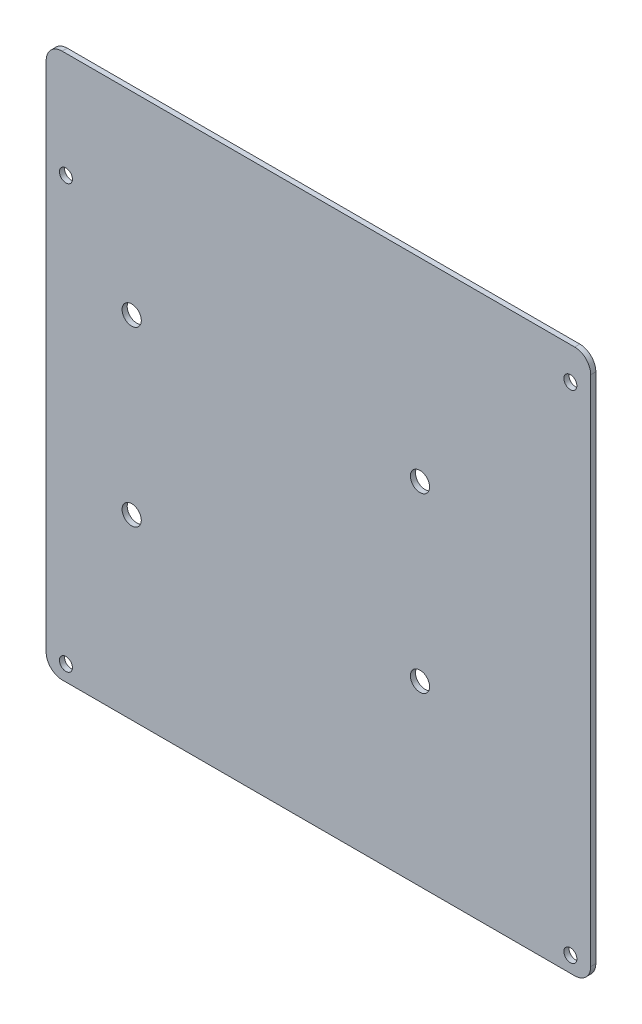
ISO-10303-21;
HEADER;
FILE_DESCRIPTION(('STEP AP214'),'2;1');
FILE_NAME('part.step','',(''),(''),'','','');
FILE_SCHEMA(('AUTOMOTIVE_DESIGN { 1 0 10303 214 1 1 1 1 }'));
ENDSEC;
DATA;
#1=APPLICATION_CONTEXT('core data for automotive mechanical design processes');
#2=APPLICATION_PROTOCOL_DEFINITION('international standard','automotive_design',2000,#1);
#3=PRODUCT_CONTEXT('',#1,'mechanical');
#4=PRODUCT('Part','Part','',(#3));
#5=PRODUCT_RELATED_PRODUCT_CATEGORY('part','',(#4));
#6=PRODUCT_DEFINITION_FORMATION('','',#4);
#7=PRODUCT_DEFINITION_CONTEXT('part definition',#1,'design');
#8=PRODUCT_DEFINITION('design','',#6,#7);
#9=PRODUCT_DEFINITION_SHAPE('','',#8);
#10=(LENGTH_UNIT() NAMED_UNIT(*) SI_UNIT(.MILLI.,.METRE.));
#11=(NAMED_UNIT(*) PLANE_ANGLE_UNIT() SI_UNIT($,.RADIAN.));
#12=(NAMED_UNIT(*) SI_UNIT($,.STERADIAN.) SOLID_ANGLE_UNIT());
#13=UNCERTAINTY_MEASURE_WITH_UNIT(LENGTH_MEASURE(1.E-05),#10,'distance_accuracy_value','');
#14=(GEOMETRIC_REPRESENTATION_CONTEXT(3) GLOBAL_UNCERTAINTY_ASSIGNED_CONTEXT((#13)) GLOBAL_UNIT_ASSIGNED_CONTEXT((#10,
#11,#12)) REPRESENTATION_CONTEXT('',''));
#15=CARTESIAN_POINT('',(0.,0.,0.));
#16=DIRECTION('',(0.,0.,1.));
#17=DIRECTION('',(1.,0.,0.));
#18=AXIS2_PLACEMENT_3D('',#15,#16,#17);
#19=CARTESIAN_POINT('',(-85.,-85.,1.6));
#20=DIRECTION('',(1.,0.,0.));
#21=DIRECTION('',(0.,0.,-1.));
#22=AXIS2_PLACEMENT_3D('',#19,#20,#21);
#23=PLANE('',#22);
#24=DIRECTION('',(0.,-1.,0.));
#25=VECTOR('',#24,1.);
#26=CARTESIAN_POINT('',(-85.,-85.,1.6));
#27=LINE('',#26,#25);
#28=CARTESIAN_POINT('',(-85.,80.,1.6));
#29=VERTEX_POINT('',#28);
#30=CARTESIAN_POINT('',(-85.,-80.,1.6));
#31=VERTEX_POINT('',#30);
#32=EDGE_CURVE('E119',#29,#31,#27,.T.);
#33=ORIENTED_EDGE('',*,*,#32,.F.);
#34=DIRECTION('',(0.,0.,-1.));
#35=VECTOR('',#34,1.);
#36=CARTESIAN_POINT('',(-85.,80.,1.6));
#37=LINE('',#36,#35);
#38=CARTESIAN_POINT('',(-85.,80.,0.));
#39=VERTEX_POINT('',#38);
#40=EDGE_CURVE('E104',#29,#39,#37,.T.);
#41=ORIENTED_EDGE('',*,*,#40,.T.);
#42=DIRECTION('',(0.,-1.,0.));
#43=VECTOR('',#42,1.);
#44=CARTESIAN_POINT('',(-85.,-85.,0.));
#45=LINE('',#44,#43);
#46=CARTESIAN_POINT('',(-85.,-80.,0.));
#47=VERTEX_POINT('',#46);
#48=EDGE_CURVE('E116',#39,#47,#45,.T.);
#49=ORIENTED_EDGE('',*,*,#48,.T.);
#50=DIRECTION('',(0.,0.,-1.));
#51=VECTOR('',#50,1.);
#52=CARTESIAN_POINT('',(-85.,-80.,1.6));
#53=LINE('',#52,#51);
#54=EDGE_CURVE('E121',#47,#31,#53,.F.);
#55=ORIENTED_EDGE('',*,*,#54,.T.);
#56=EDGE_LOOP('',(#33,#41,#49,#55));
#57=FACE_BOUND('',#56,.T.);
#58=ADVANCED_FACE('F34',(#57),#23,.F.);
#59=CARTESIAN_POINT('',(85.,-85.,1.6));
#60=DIRECTION('',(0.,1.,0.));
#61=DIRECTION('',(-1.,0.,0.));
#62=AXIS2_PLACEMENT_3D('',#59,#60,#61);
#63=PLANE('',#62);
#64=DIRECTION('',(1.,0.,0.));
#65=VECTOR('',#64,1.);
#66=CARTESIAN_POINT('',(85.,-85.,0.));
#67=LINE('',#66,#65);
#68=CARTESIAN_POINT('',(-80.,-85.,0.));
#69=VERTEX_POINT('',#68);
#70=CARTESIAN_POINT('',(80.,-85.,0.));
#71=VERTEX_POINT('',#70);
#72=EDGE_CURVE('E125',#69,#71,#67,.T.);
#73=ORIENTED_EDGE('',*,*,#72,.T.);
#74=DIRECTION('',(0.,0.,-1.));
#75=VECTOR('',#74,1.);
#76=CARTESIAN_POINT('',(80.,-85.,1.6));
#77=LINE('',#76,#75);
#78=CARTESIAN_POINT('',(80.,-85.,1.6));
#79=VERTEX_POINT('',#78);
#80=EDGE_CURVE('E11',#71,#79,#77,.F.);
#81=ORIENTED_EDGE('',*,*,#80,.T.);
#82=DIRECTION('',(1.,0.,0.));
#83=VECTOR('',#82,1.);
#84=CARTESIAN_POINT('',(85.,-85.,1.6));
#85=LINE('',#84,#83);
#86=CARTESIAN_POINT('',(-80.,-85.,1.6));
#87=VERTEX_POINT('',#86);
#88=EDGE_CURVE('E165',#87,#79,#85,.T.);
#89=ORIENTED_EDGE('',*,*,#88,.F.);
#90=DIRECTION('',(0.,0.,-1.));
#91=VECTOR('',#90,1.);
#92=CARTESIAN_POINT('',(-80.,-85.,1.6));
#93=LINE('',#92,#91);
#94=EDGE_CURVE('E42',#87,#69,#93,.T.);
#95=ORIENTED_EDGE('',*,*,#94,.T.);
#96=EDGE_LOOP('',(#73,#81,#89,#95));
#97=FACE_BOUND('',#96,.T.);
#98=ADVANCED_FACE('F163',(#97),#63,.F.);
#99=CARTESIAN_POINT('',(85.,-85.,1.6));
#100=DIRECTION('',(-1.,0.,0.));
#101=DIRECTION('',(0.,0.,1.));
#102=AXIS2_PLACEMENT_3D('',#99,#100,#101);
#103=PLANE('',#102);
#104=DIRECTION('',(0.,1.,0.));
#105=VECTOR('',#104,1.);
#106=CARTESIAN_POINT('',(85.,-85.,0.));
#107=LINE('',#106,#105);
#108=CARTESIAN_POINT('',(85.,-80.,0.));
#109=VERTEX_POINT('',#108);
#110=CARTESIAN_POINT('',(85.,80.,0.));
#111=VERTEX_POINT('',#110);
#112=EDGE_CURVE('E129',#109,#111,#107,.T.);
#113=ORIENTED_EDGE('',*,*,#112,.T.);
#114=DIRECTION('',(0.,0.,-1.));
#115=VECTOR('',#114,1.);
#116=CARTESIAN_POINT('',(85.,80.,1.6));
#117=LINE('',#116,#115);
#118=CARTESIAN_POINT('',(85.,80.,1.6));
#119=VERTEX_POINT('',#118);
#120=EDGE_CURVE('E49',#111,#119,#117,.F.);
#121=ORIENTED_EDGE('',*,*,#120,.T.);
#122=DIRECTION('',(0.,1.,0.));
#123=VECTOR('',#122,1.);
#124=CARTESIAN_POINT('',(85.,-85.,1.6));
#125=LINE('',#124,#123);
#126=CARTESIAN_POINT('',(85.,-80.,1.6));
#127=VERTEX_POINT('',#126);
#128=EDGE_CURVE('E173',#127,#119,#125,.T.);
#129=ORIENTED_EDGE('',*,*,#128,.F.);
#130=DIRECTION('',(0.,0.,-1.));
#131=VECTOR('',#130,1.);
#132=CARTESIAN_POINT('',(85.,-80.,1.6));
#133=LINE('',#132,#131);
#134=EDGE_CURVE('E156',#127,#109,#133,.T.);
#135=ORIENTED_EDGE('',*,*,#134,.T.);
#136=EDGE_LOOP('',(#113,#121,#129,#135));
#137=FACE_BOUND('',#136,.T.);
#138=ADVANCED_FACE('F172',(#137),#103,.F.);
#139=CARTESIAN_POINT('',(85.,85.,1.6));
#140=DIRECTION('',(0.,-1.,0.));
#141=DIRECTION('',(1.,0.,0.));
#142=AXIS2_PLACEMENT_3D('',#139,#140,#141);
#143=PLANE('',#142);
#144=DIRECTION('',(-1.,0.,0.));
#145=VECTOR('',#144,1.);
#146=CARTESIAN_POINT('',(85.,85.,0.));
#147=LINE('',#146,#145);
#148=CARTESIAN_POINT('',(80.,85.,0.));
#149=VERTEX_POINT('',#148);
#150=CARTESIAN_POINT('',(-80.,85.,0.));
#151=VERTEX_POINT('',#150);
#152=EDGE_CURVE('E139',#149,#151,#147,.T.);
#153=ORIENTED_EDGE('',*,*,#152,.T.);
#154=DIRECTION('',(0.,0.,-1.));
#155=VECTOR('',#154,1.);
#156=CARTESIAN_POINT('',(-80.,85.,1.6));
#157=LINE('',#156,#155);
#158=CARTESIAN_POINT('',(-80.,85.,1.6));
#159=VERTEX_POINT('',#158);
#160=EDGE_CURVE('E105',#151,#159,#157,.F.);
#161=ORIENTED_EDGE('',*,*,#160,.T.);
#162=DIRECTION('',(-1.,0.,0.));
#163=VECTOR('',#162,1.);
#164=CARTESIAN_POINT('',(85.,85.,1.6));
#165=LINE('',#164,#163);
#166=CARTESIAN_POINT('',(80.,85.,1.6));
#167=VERTEX_POINT('',#166);
#168=EDGE_CURVE('E135',#167,#159,#165,.T.);
#169=ORIENTED_EDGE('',*,*,#168,.F.);
#170=DIRECTION('',(0.,0.,-1.));
#171=VECTOR('',#170,1.);
#172=CARTESIAN_POINT('',(80.,85.,1.6));
#173=LINE('',#172,#171);
#174=EDGE_CURVE('E110',#167,#149,#173,.T.);
#175=ORIENTED_EDGE('',*,*,#174,.T.);
#176=EDGE_LOOP('',(#153,#161,#169,#175));
#177=FACE_BOUND('',#176,.T.);
#178=ADVANCED_FACE('F237',(#177),#143,.F.);
#179=CARTESIAN_POINT('',(0.,0.,1.6));
#180=DIRECTION('',(0.,0.,1.));
#181=DIRECTION('',(1.,0.,0.));
#182=AXIS2_PLACEMENT_3D('',#179,#180,#181);
#183=PLANE('',#182);
#184=CARTESIAN_POINT('',(-58.3,-29.5,1.6));
#185=DIRECTION('',(0.,0.,1.));
#186=DIRECTION('',(1.,0.,0.));
#187=AXIS2_PLACEMENT_3D('',#184,#185,#186);
#188=CIRCLE('',#187,3.);
#189=CARTESIAN_POINT('',(-55.3,-29.5,1.6));
#190=VERTEX_POINT('',#189);
#191=EDGE_CURVE('E206',#190,#190,#188,.T.);
#192=ORIENTED_EDGE('',*,*,#191,.F.);
#193=EDGE_LOOP('',(#192));
#194=FACE_BOUND('',#193,.T.);
#195=CARTESIAN_POINT('',(31.7,-29.5,1.6));
#196=DIRECTION('',(0.,0.,1.));
#197=DIRECTION('',(1.,0.,0.));
#198=AXIS2_PLACEMENT_3D('',#195,#196,#197);
#199=CIRCLE('',#198,3.);
#200=CARTESIAN_POINT('',(34.7,-29.5,1.6));
#201=VERTEX_POINT('',#200);
#202=EDGE_CURVE('E212',#201,#201,#199,.T.);
#203=ORIENTED_EDGE('',*,*,#202,.F.);
#204=EDGE_LOOP('',(#203));
#205=FACE_BOUND('',#204,.T.);
#206=CARTESIAN_POINT('',(31.7,24.5,1.6));
#207=DIRECTION('',(0.,0.,1.));
#208=DIRECTION('',(1.,0.,0.));
#209=AXIS2_PLACEMENT_3D('',#206,#207,#208);
#210=CIRCLE('',#209,3.);
#211=CARTESIAN_POINT('',(34.7,24.5,1.6));
#212=VERTEX_POINT('',#211);
#213=EDGE_CURVE('E218',#212,#212,#210,.T.);
#214=ORIENTED_EDGE('',*,*,#213,.F.);
#215=EDGE_LOOP('',(#214));
#216=FACE_BOUND('',#215,.T.);
#217=CARTESIAN_POINT('',(-58.3,24.5,1.6));
#218=DIRECTION('',(0.,0.,1.));
#219=DIRECTION('',(1.,0.,0.));
#220=AXIS2_PLACEMENT_3D('',#217,#218,#219);
#221=CIRCLE('',#220,3.);
#222=CARTESIAN_POINT('',(-55.3,24.5,1.6));
#223=VERTEX_POINT('',#222);
#224=EDGE_CURVE('E200',#223,#223,#221,.T.);
#225=ORIENTED_EDGE('',*,*,#224,.F.);
#226=EDGE_LOOP('',(#225));
#227=FACE_BOUND('',#226,.T.);
#228=CARTESIAN_POINT('',(78.65,74.84,1.6));
#229=DIRECTION('',(0.,0.,1.));
#230=DIRECTION('',(1.,0.,0.));
#231=AXIS2_PLACEMENT_3D('',#228,#229,#230);
#232=CIRCLE('',#231,2.03);
#233=CARTESIAN_POINT('',(80.68,74.84,1.6));
#234=VERTEX_POINT('',#233);
#235=EDGE_CURVE('E189',#234,#234,#232,.T.);
#236=ORIENTED_EDGE('',*,*,#235,.F.);
#237=EDGE_LOOP('',(#236));
#238=FACE_BOUND('',#237,.T.);
#239=CARTESIAN_POINT('',(-78.83,-80.1,1.6));
#240=DIRECTION('',(0.,0.,1.));
#241=DIRECTION('',(1.,0.,0.));
#242=AXIS2_PLACEMENT_3D('',#239,#240,#241);
#243=CIRCLE('',#242,2.03);
#244=CARTESIAN_POINT('',(-76.8,-80.1,1.6));
#245=VERTEX_POINT('',#244);
#246=EDGE_CURVE('E182',#245,#245,#243,.T.);
#247=ORIENTED_EDGE('',*,*,#246,.F.);
#248=EDGE_LOOP('',(#247));
#249=FACE_BOUND('',#248,.T.);
#250=CARTESIAN_POINT('',(78.65,-80.1,1.6));
#251=DIRECTION('',(0.,0.,1.));
#252=DIRECTION('',(1.,0.,0.));
#253=AXIS2_PLACEMENT_3D('',#250,#251,#252);
#254=CIRCLE('',#253,2.03);
#255=CARTESIAN_POINT('',(80.68,-80.1,1.6));
#256=VERTEX_POINT('',#255);
#257=EDGE_CURVE('E194',#256,#256,#254,.T.);
#258=ORIENTED_EDGE('',*,*,#257,.F.);
#259=EDGE_LOOP('',(#258));
#260=FACE_BOUND('',#259,.T.);
#261=CARTESIAN_POINT('',(-78.83,51.98,1.6));
#262=DIRECTION('',(0.,0.,1.));
#263=DIRECTION('',(1.,0.,0.));
#264=AXIS2_PLACEMENT_3D('',#261,#262,#263);
#265=CIRCLE('',#264,2.03);
#266=CARTESIAN_POINT('',(-76.8,51.98,1.6));
#267=VERTEX_POINT('',#266);
#268=EDGE_CURVE('E132',#267,#267,#265,.T.);
#269=ORIENTED_EDGE('',*,*,#268,.F.);
#270=EDGE_LOOP('',(#269));
#271=FACE_BOUND('',#270,.T.);
#272=ORIENTED_EDGE('',*,*,#168,.T.);
#273=CARTESIAN_POINT('',(-80.,80.,1.6));
#274=DIRECTION('',(0.,0.,1.));
#275=DIRECTION('',(1.,0.,0.));
#276=AXIS2_PLACEMENT_3D('',#273,#274,#275);
#277=CIRCLE('',#276,5.);
#278=EDGE_CURVE('E154',#159,#29,#277,.T.);
#279=ORIENTED_EDGE('',*,*,#278,.T.);
#280=ORIENTED_EDGE('',*,*,#32,.T.);
#281=CARTESIAN_POINT('',(-80.,-80.,1.6));
#282=DIRECTION('',(0.,0.,1.));
#283=DIRECTION('',(1.,0.,0.));
#284=AXIS2_PLACEMENT_3D('',#281,#282,#283);
#285=CIRCLE('',#284,5.);
#286=EDGE_CURVE('E149',#31,#87,#285,.T.);
#287=ORIENTED_EDGE('',*,*,#286,.T.);
#288=ORIENTED_EDGE('',*,*,#88,.T.);
#289=CARTESIAN_POINT('',(80.,-80.,1.6));
#290=DIRECTION('',(0.,0.,1.));
#291=DIRECTION('',(1.,0.,0.));
#292=AXIS2_PLACEMENT_3D('',#289,#290,#291);
#293=CIRCLE('',#292,5.);
#294=EDGE_CURVE('E56',#79,#127,#293,.T.);
#295=ORIENTED_EDGE('',*,*,#294,.T.);
#296=ORIENTED_EDGE('',*,*,#128,.T.);
#297=CARTESIAN_POINT('',(80.,80.,1.6));
#298=DIRECTION('',(0.,0.,1.));
#299=DIRECTION('',(1.,0.,0.));
#300=AXIS2_PLACEMENT_3D('',#297,#298,#299);
#301=CIRCLE('',#300,5.);
#302=EDGE_CURVE('E152',#119,#167,#301,.T.);
#303=ORIENTED_EDGE('',*,*,#302,.T.);
#304=EDGE_LOOP('',(#272,#279,#280,#287,#288,#295,#296,#303));
#305=FACE_BOUND('',#304,.T.);
#306=ADVANCED_FACE('F234',(#194,#205,#216,#227,#238,#249,#260,#271,#305),#183,.T.);
#307=CARTESIAN_POINT('',(0.,0.,0.));
#308=DIRECTION('',(0.,0.,1.));
#309=DIRECTION('',(1.,0.,0.));
#310=AXIS2_PLACEMENT_3D('',#307,#308,#309);
#311=PLANE('',#310);
#312=CARTESIAN_POINT('',(-58.3,-29.5,0.));
#313=DIRECTION('',(0.,0.,1.));
#314=DIRECTION('',(1.,0.,0.));
#315=AXIS2_PLACEMENT_3D('',#312,#313,#314);
#316=CIRCLE('',#315,3.);
#317=CARTESIAN_POINT('',(-55.3,-29.5,0.));
#318=VERTEX_POINT('',#317);
#319=EDGE_CURVE('E209',#318,#318,#316,.T.);
#320=ORIENTED_EDGE('',*,*,#319,.T.);
#321=EDGE_LOOP('',(#320));
#322=FACE_BOUND('',#321,.T.);
#323=CARTESIAN_POINT('',(31.7,-29.5,0.));
#324=DIRECTION('',(0.,0.,1.));
#325=DIRECTION('',(1.,0.,0.));
#326=AXIS2_PLACEMENT_3D('',#323,#324,#325);
#327=CIRCLE('',#326,3.);
#328=CARTESIAN_POINT('',(34.7,-29.5,0.));
#329=VERTEX_POINT('',#328);
#330=EDGE_CURVE('E215',#329,#329,#327,.T.);
#331=ORIENTED_EDGE('',*,*,#330,.T.);
#332=EDGE_LOOP('',(#331));
#333=FACE_BOUND('',#332,.T.);
#334=CARTESIAN_POINT('',(31.7,24.5,0.));
#335=DIRECTION('',(0.,0.,1.));
#336=DIRECTION('',(1.,0.,0.));
#337=AXIS2_PLACEMENT_3D('',#334,#335,#336);
#338=CIRCLE('',#337,3.);
#339=CARTESIAN_POINT('',(34.7,24.5,0.));
#340=VERTEX_POINT('',#339);
#341=EDGE_CURVE('E203',#340,#340,#338,.T.);
#342=ORIENTED_EDGE('',*,*,#341,.T.);
#343=EDGE_LOOP('',(#342));
#344=FACE_BOUND('',#343,.T.);
#345=CARTESIAN_POINT('',(-58.3,24.5,0.));
#346=DIRECTION('',(0.,0.,1.));
#347=DIRECTION('',(1.,0.,0.));
#348=AXIS2_PLACEMENT_3D('',#345,#346,#347);
#349=CIRCLE('',#348,3.);
#350=CARTESIAN_POINT('',(-55.3,24.5,0.));
#351=VERTEX_POINT('',#350);
#352=EDGE_CURVE('E197',#351,#351,#349,.T.);
#353=ORIENTED_EDGE('',*,*,#352,.T.);
#354=EDGE_LOOP('',(#353));
#355=FACE_BOUND('',#354,.T.);
#356=CARTESIAN_POINT('',(78.65,74.84,0.));
#357=DIRECTION('',(0.,0.,1.));
#358=DIRECTION('',(1.,0.,0.));
#359=AXIS2_PLACEMENT_3D('',#356,#357,#358);
#360=CIRCLE('',#359,2.03);
#361=CARTESIAN_POINT('',(80.68,74.84,0.));
#362=VERTEX_POINT('',#361);
#363=EDGE_CURVE('E180',#362,#362,#360,.T.);
#364=ORIENTED_EDGE('',*,*,#363,.T.);
#365=EDGE_LOOP('',(#364));
#366=FACE_BOUND('',#365,.T.);
#367=CARTESIAN_POINT('',(-78.83,-80.1,0.));
#368=DIRECTION('',(0.,0.,1.));
#369=DIRECTION('',(1.,0.,0.));
#370=AXIS2_PLACEMENT_3D('',#367,#368,#369);
#371=CIRCLE('',#370,2.03);
#372=CARTESIAN_POINT('',(-76.8,-80.1,0.));
#373=VERTEX_POINT('',#372);
#374=EDGE_CURVE('E185',#373,#373,#371,.T.);
#375=ORIENTED_EDGE('',*,*,#374,.T.);
#376=EDGE_LOOP('',(#375));
#377=FACE_BOUND('',#376,.T.);
#378=CARTESIAN_POINT('',(78.65,-80.1,0.));
#379=DIRECTION('',(0.,0.,1.));
#380=DIRECTION('',(1.,0.,0.));
#381=AXIS2_PLACEMENT_3D('',#378,#379,#380);
#382=CIRCLE('',#381,2.03);
#383=CARTESIAN_POINT('',(80.68,-80.1,0.));
#384=VERTEX_POINT('',#383);
#385=EDGE_CURVE('E186',#384,#384,#382,.T.);
#386=ORIENTED_EDGE('',*,*,#385,.T.);
#387=EDGE_LOOP('',(#386));
#388=FACE_BOUND('',#387,.T.);
#389=CARTESIAN_POINT('',(-78.83,51.98,0.));
#390=DIRECTION('',(0.,0.,1.));
#391=DIRECTION('',(1.,0.,0.));
#392=AXIS2_PLACEMENT_3D('',#389,#390,#391);
#393=CIRCLE('',#392,2.03);
#394=CARTESIAN_POINT('',(-76.8,51.98,0.));
#395=VERTEX_POINT('',#394);
#396=EDGE_CURVE('E126',#395,#395,#393,.T.);
#397=ORIENTED_EDGE('',*,*,#396,.T.);
#398=EDGE_LOOP('',(#397));
#399=FACE_BOUND('',#398,.T.);
#400=ORIENTED_EDGE('',*,*,#48,.F.);
#401=CARTESIAN_POINT('',(-80.,80.,0.));
#402=DIRECTION('',(0.,0.,1.));
#403=DIRECTION('',(1.,0.,0.));
#404=AXIS2_PLACEMENT_3D('',#401,#402,#403);
#405=CIRCLE('',#404,5.);
#406=EDGE_CURVE('E100',#39,#151,#405,.F.);
#407=ORIENTED_EDGE('',*,*,#406,.T.);
#408=ORIENTED_EDGE('',*,*,#152,.F.);
#409=CARTESIAN_POINT('',(80.,80.,0.));
#410=DIRECTION('',(0.,0.,1.));
#411=DIRECTION('',(1.,0.,0.));
#412=AXIS2_PLACEMENT_3D('',#409,#410,#411);
#413=CIRCLE('',#412,5.);
#414=EDGE_CURVE('E111',#149,#111,#413,.F.);
#415=ORIENTED_EDGE('',*,*,#414,.T.);
#416=ORIENTED_EDGE('',*,*,#112,.F.);
#417=CARTESIAN_POINT('',(80.,-80.,0.));
#418=DIRECTION('',(0.,0.,1.));
#419=DIRECTION('',(1.,0.,0.));
#420=AXIS2_PLACEMENT_3D('',#417,#418,#419);
#421=CIRCLE('',#420,5.);
#422=EDGE_CURVE('E143',#109,#71,#421,.F.);
#423=ORIENTED_EDGE('',*,*,#422,.T.);
#424=ORIENTED_EDGE('',*,*,#72,.F.);
#425=CARTESIAN_POINT('',(-80.,-80.,0.));
#426=DIRECTION('',(0.,0.,1.));
#427=DIRECTION('',(1.,0.,0.));
#428=AXIS2_PLACEMENT_3D('',#425,#426,#427);
#429=CIRCLE('',#428,5.);
#430=EDGE_CURVE('E120',#69,#47,#429,.F.);
#431=ORIENTED_EDGE('',*,*,#430,.T.);
#432=EDGE_LOOP('',(#400,#407,#408,#415,#416,#423,#424,#431));
#433=FACE_BOUND('',#432,.T.);
#434=ADVANCED_FACE('F123',(#322,#333,#344,#355,#366,#377,#388,#399,#433),#311,.F.);
#435=CARTESIAN_POINT('',(-80.,80.,1.6));
#436=DIRECTION('',(0.,0.,-1.));
#437=DIRECTION('',(-1.,0.,0.));
#438=AXIS2_PLACEMENT_3D('',#435,#436,#437);
#439=CYLINDRICAL_SURFACE('',#438,5.);
#440=ORIENTED_EDGE('',*,*,#278,.F.);
#441=ORIENTED_EDGE('',*,*,#160,.F.);
#442=ORIENTED_EDGE('',*,*,#406,.F.);
#443=ORIENTED_EDGE('',*,*,#40,.F.);
#444=EDGE_LOOP('',(#440,#441,#442,#443));
#445=FACE_BOUND('',#444,.T.);
#446=ADVANCED_FACE('F103',(#445),#439,.T.);
#447=CARTESIAN_POINT('',(80.,80.,1.6));
#448=DIRECTION('',(0.,0.,-1.));
#449=DIRECTION('',(-1.,0.,0.));
#450=AXIS2_PLACEMENT_3D('',#447,#448,#449);
#451=CYLINDRICAL_SURFACE('',#450,5.);
#452=ORIENTED_EDGE('',*,*,#302,.F.);
#453=ORIENTED_EDGE('',*,*,#120,.F.);
#454=ORIENTED_EDGE('',*,*,#414,.F.);
#455=ORIENTED_EDGE('',*,*,#174,.F.);
#456=EDGE_LOOP('',(#452,#453,#454,#455));
#457=FACE_BOUND('',#456,.T.);
#458=ADVANCED_FACE('F253',(#457),#451,.T.);
#459=CARTESIAN_POINT('',(80.,-80.,1.6));
#460=DIRECTION('',(0.,0.,-1.));
#461=DIRECTION('',(-1.,0.,0.));
#462=AXIS2_PLACEMENT_3D('',#459,#460,#461);
#463=CYLINDRICAL_SURFACE('',#462,5.);
#464=ORIENTED_EDGE('',*,*,#294,.F.);
#465=ORIENTED_EDGE('',*,*,#80,.F.);
#466=ORIENTED_EDGE('',*,*,#422,.F.);
#467=ORIENTED_EDGE('',*,*,#134,.F.);
#468=EDGE_LOOP('',(#464,#465,#466,#467));
#469=FACE_BOUND('',#468,.T.);
#470=ADVANCED_FACE('F171',(#469),#463,.T.);
#471=CARTESIAN_POINT('',(-80.,-80.,1.6));
#472=DIRECTION('',(0.,0.,-1.));
#473=DIRECTION('',(-1.,0.,0.));
#474=AXIS2_PLACEMENT_3D('',#471,#472,#473);
#475=CYLINDRICAL_SURFACE('',#474,5.);
#476=ORIENTED_EDGE('',*,*,#286,.F.);
#477=ORIENTED_EDGE('',*,*,#54,.F.);
#478=ORIENTED_EDGE('',*,*,#430,.F.);
#479=ORIENTED_EDGE('',*,*,#94,.F.);
#480=EDGE_LOOP('',(#476,#477,#478,#479));
#481=FACE_BOUND('',#480,.T.);
#482=ADVANCED_FACE('F36',(#481),#475,.T.);
#483=CARTESIAN_POINT('',(-78.83,51.98,0.));
#484=DIRECTION('',(0.,0.,1.));
#485=DIRECTION('',(1.,0.,0.));
#486=AXIS2_PLACEMENT_3D('',#483,#484,#485);
#487=CYLINDRICAL_SURFACE('',#486,2.03);
#488=ORIENTED_EDGE('',*,*,#396,.F.);
#489=EDGE_LOOP('',(#488));
#490=FACE_BOUND('',#489,.T.);
#491=ORIENTED_EDGE('',*,*,#268,.T.);
#492=EDGE_LOOP('',(#491));
#493=FACE_BOUND('',#492,.T.);
#494=ADVANCED_FACE('F275',(#490,#493),#487,.F.);
#495=CARTESIAN_POINT('',(78.65,-80.1,0.));
#496=DIRECTION('',(0.,0.,1.));
#497=DIRECTION('',(1.,0.,0.));
#498=AXIS2_PLACEMENT_3D('',#495,#496,#497);
#499=CYLINDRICAL_SURFACE('',#498,2.03);
#500=ORIENTED_EDGE('',*,*,#385,.F.);
#501=EDGE_LOOP('',(#500));
#502=FACE_BOUND('',#501,.T.);
#503=ORIENTED_EDGE('',*,*,#257,.T.);
#504=EDGE_LOOP('',(#503));
#505=FACE_BOUND('',#504,.T.);
#506=ADVANCED_FACE('F278',(#502,#505),#499,.F.);
#507=CARTESIAN_POINT('',(-78.83,-80.1,0.));
#508=DIRECTION('',(0.,0.,1.));
#509=DIRECTION('',(1.,0.,0.));
#510=AXIS2_PLACEMENT_3D('',#507,#508,#509);
#511=CYLINDRICAL_SURFACE('',#510,2.03);
#512=ORIENTED_EDGE('',*,*,#374,.F.);
#513=EDGE_LOOP('',(#512));
#514=FACE_BOUND('',#513,.T.);
#515=ORIENTED_EDGE('',*,*,#246,.T.);
#516=EDGE_LOOP('',(#515));
#517=FACE_BOUND('',#516,.T.);
#518=ADVANCED_FACE('F280',(#514,#517),#511,.F.);
#519=CARTESIAN_POINT('',(78.65,74.84,0.));
#520=DIRECTION('',(0.,0.,1.));
#521=DIRECTION('',(1.,0.,0.));
#522=AXIS2_PLACEMENT_3D('',#519,#520,#521);
#523=CYLINDRICAL_SURFACE('',#522,2.03);
#524=ORIENTED_EDGE('',*,*,#363,.F.);
#525=EDGE_LOOP('',(#524));
#526=FACE_BOUND('',#525,.T.);
#527=ORIENTED_EDGE('',*,*,#235,.T.);
#528=EDGE_LOOP('',(#527));
#529=FACE_BOUND('',#528,.T.);
#530=ADVANCED_FACE('F283',(#526,#529),#523,.F.);
#531=CARTESIAN_POINT('',(-58.3,24.5,0.));
#532=DIRECTION('',(0.,0.,1.));
#533=DIRECTION('',(1.,0.,0.));
#534=AXIS2_PLACEMENT_3D('',#531,#532,#533);
#535=CYLINDRICAL_SURFACE('',#534,3.);
#536=ORIENTED_EDGE('',*,*,#352,.F.);
#537=EDGE_LOOP('',(#536));
#538=FACE_BOUND('',#537,.T.);
#539=ORIENTED_EDGE('',*,*,#224,.T.);
#540=EDGE_LOOP('',(#539));
#541=FACE_BOUND('',#540,.T.);
#542=ADVANCED_FACE('F230',(#538,#541),#535,.F.);
#543=CARTESIAN_POINT('',(31.7,24.5,0.));
#544=DIRECTION('',(0.,0.,1.));
#545=DIRECTION('',(1.,0.,0.));
#546=AXIS2_PLACEMENT_3D('',#543,#544,#545);
#547=CYLINDRICAL_SURFACE('',#546,3.);
#548=ORIENTED_EDGE('',*,*,#341,.F.);
#549=EDGE_LOOP('',(#548));
#550=FACE_BOUND('',#549,.T.);
#551=ORIENTED_EDGE('',*,*,#213,.T.);
#552=EDGE_LOOP('',(#551));
#553=FACE_BOUND('',#552,.T.);
#554=ADVANCED_FACE('F226',(#550,#553),#547,.F.);
#555=CARTESIAN_POINT('',(31.7,-29.5,0.));
#556=DIRECTION('',(0.,0.,1.));
#557=DIRECTION('',(1.,0.,0.));
#558=AXIS2_PLACEMENT_3D('',#555,#556,#557);
#559=CYLINDRICAL_SURFACE('',#558,3.);
#560=ORIENTED_EDGE('',*,*,#330,.F.);
#561=EDGE_LOOP('',(#560));
#562=FACE_BOUND('',#561,.T.);
#563=ORIENTED_EDGE('',*,*,#202,.T.);
#564=EDGE_LOOP('',(#563));
#565=FACE_BOUND('',#564,.T.);
#566=ADVANCED_FACE('F229',(#562,#565),#559,.F.);
#567=CARTESIAN_POINT('',(-58.3,-29.5,0.));
#568=DIRECTION('',(0.,0.,1.));
#569=DIRECTION('',(1.,0.,0.));
#570=AXIS2_PLACEMENT_3D('',#567,#568,#569);
#571=CYLINDRICAL_SURFACE('',#570,3.);
#572=ORIENTED_EDGE('',*,*,#319,.F.);
#573=EDGE_LOOP('',(#572));
#574=FACE_BOUND('',#573,.T.);
#575=ORIENTED_EDGE('',*,*,#191,.T.);
#576=EDGE_LOOP('',(#575));
#577=FACE_BOUND('',#576,.T.);
#578=ADVANCED_FACE('F294',(#574,#577),#571,.F.);
#579=CLOSED_SHELL('',(#58,#98,#138,#178,#306,#434,#446,#458,#470,#482,#494,#506,#518,#530,#542,
#554,#566,#578));
#580=MANIFOLD_SOLID_BREP('B2',#579);
#581=ADVANCED_BREP_SHAPE_REPRESENTATION('',(#18,#580),#14);
#582=SHAPE_DEFINITION_REPRESENTATION(#9,#581);
ENDSEC;
END-ISO-10303-21;
